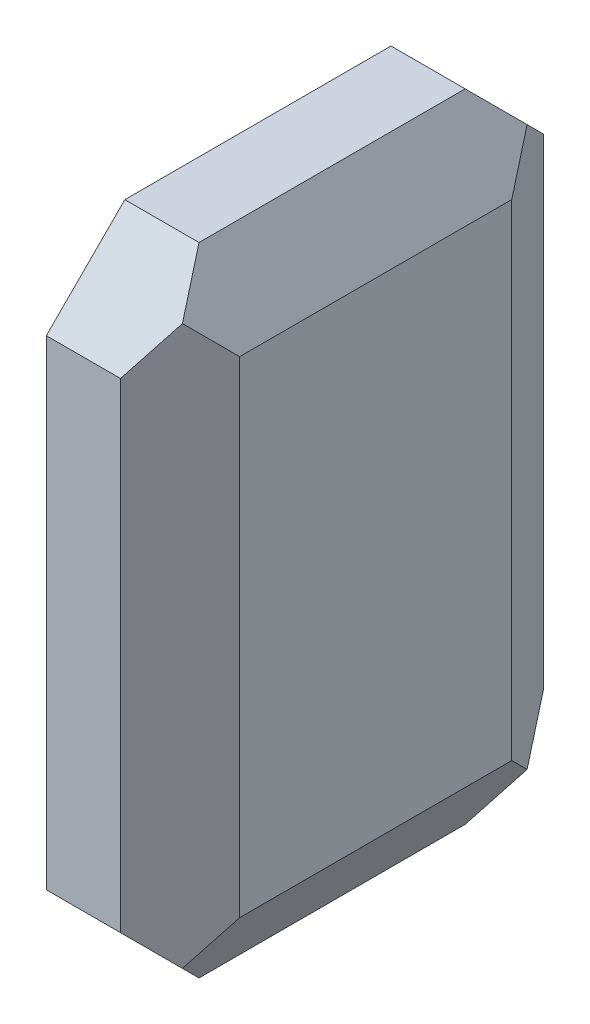
ISO-10303-21;
HEADER;
FILE_DESCRIPTION(('STEP AP214'),'2;1');
FILE_NAME('part.step','',(''),(''),'','','');
FILE_SCHEMA(('AUTOMOTIVE_DESIGN { 1 0 10303 214 1 1 1 1 }'));
ENDSEC;
DATA;
#1=APPLICATION_CONTEXT('core data for automotive mechanical design processes');
#2=APPLICATION_PROTOCOL_DEFINITION('international standard','automotive_design',2000,#1);
#3=PRODUCT_CONTEXT('',#1,'mechanical');
#4=PRODUCT('Part','Part','',(#3));
#5=PRODUCT_RELATED_PRODUCT_CATEGORY('part','',(#4));
#6=PRODUCT_DEFINITION_FORMATION('','',#4);
#7=PRODUCT_DEFINITION_CONTEXT('part definition',#1,'design');
#8=PRODUCT_DEFINITION('design','',#6,#7);
#9=PRODUCT_DEFINITION_SHAPE('','',#8);
#10=(LENGTH_UNIT() NAMED_UNIT(*) SI_UNIT(.MILLI.,.METRE.));
#11=(NAMED_UNIT(*) PLANE_ANGLE_UNIT() SI_UNIT($,.RADIAN.));
#12=(NAMED_UNIT(*) SI_UNIT($,.STERADIAN.) SOLID_ANGLE_UNIT());
#13=UNCERTAINTY_MEASURE_WITH_UNIT(LENGTH_MEASURE(1.E-05),#10,'distance_accuracy_value','');
#14=(GEOMETRIC_REPRESENTATION_CONTEXT(3) GLOBAL_UNCERTAINTY_ASSIGNED_CONTEXT((#13)) GLOBAL_UNIT_ASSIGNED_CONTEXT((#10,
#11,#12)) REPRESENTATION_CONTEXT('',''));
#15=CARTESIAN_POINT('',(0.,0.,0.));
#16=DIRECTION('',(0.,0.,1.));
#17=DIRECTION('',(1.,0.,0.));
#18=AXIS2_PLACEMENT_3D('',#15,#16,#17);
#19=CARTESIAN_POINT('',(6.858,0.,-24.638));
#20=DIRECTION('',(0.,1.,0.));
#21=DIRECTION('',(0.,0.,1.));
#22=AXIS2_PLACEMENT_3D('',#19,#20,#21);
#23=PLANE('',#22);
#24=DIRECTION('',(1.,0.,0.));
#25=VECTOR('',#24,1.);
#26=CARTESIAN_POINT('',(6.858,0.,-20.066));
#27=LINE('',#26,#25);
#28=CARTESIAN_POINT('',(0.,0.,-20.066));
#29=VERTEX_POINT('',#28);
#30=CARTESIAN_POINT('',(4.318,0.,-20.066));
#31=VERTEX_POINT('',#30);
#32=EDGE_CURVE('E157',#29,#31,#27,.T.);
#33=ORIENTED_EDGE('',*,*,#32,.T.);
#34=DIRECTION('',(0.,0.,1.));
#35=VECTOR('',#34,1.);
#36=CARTESIAN_POINT('',(4.318,0.,-24.638));
#37=LINE('',#36,#35);
#38=CARTESIAN_POINT('',(4.318,0.,-4.572));
#39=VERTEX_POINT('',#38);
#40=EDGE_CURVE('E152',#31,#39,#37,.T.);
#41=ORIENTED_EDGE('',*,*,#40,.T.);
#42=DIRECTION('',(-1.,0.,0.));
#43=VECTOR('',#42,1.);
#44=CARTESIAN_POINT('',(6.858,0.,-4.572));
#45=LINE('',#44,#43);
#46=CARTESIAN_POINT('',(0.,0.,-4.57200000000001));
#47=VERTEX_POINT('',#46);
#48=EDGE_CURVE('E145',#39,#47,#45,.T.);
#49=ORIENTED_EDGE('',*,*,#48,.T.);
#50=DIRECTION('',(0.,0.,-1.));
#51=VECTOR('',#50,1.);
#52=CARTESIAN_POINT('',(0.,0.,-24.638));
#53=LINE('',#52,#51);
#54=EDGE_CURVE('E149',#47,#29,#53,.T.);
#55=ORIENTED_EDGE('',*,*,#54,.T.);
#56=EDGE_LOOP('',(#33,#41,#49,#55));
#57=FACE_BOUND('',#56,.T.);
#58=ADVANCED_FACE('F52',(#57),#23,.F.);
#59=CARTESIAN_POINT('',(6.858,37.084,-24.638));
#60=DIRECTION('',(0.,0.,1.));
#61=DIRECTION('',(0.,-1.,0.));
#62=AXIS2_PLACEMENT_3D('',#59,#60,#61);
#63=PLANE('',#62);
#64=DIRECTION('',(1.,0.,0.));
#65=VECTOR('',#64,1.);
#66=CARTESIAN_POINT('',(6.858,32.512,-24.638));
#67=LINE('',#66,#65);
#68=CARTESIAN_POINT('',(0.,32.512,-24.638));
#69=VERTEX_POINT('',#68);
#70=CARTESIAN_POINT('',(4.31799999999999,32.512,-24.638));
#71=VERTEX_POINT('',#70);
#72=EDGE_CURVE('E207',#69,#71,#67,.T.);
#73=ORIENTED_EDGE('',*,*,#72,.T.);
#74=DIRECTION('',(0.,-1.,0.));
#75=VECTOR('',#74,1.);
#76=CARTESIAN_POINT('',(4.31799999999999,37.084,-24.638));
#77=LINE('',#76,#75);
#78=CARTESIAN_POINT('',(4.31799999999999,4.572,-24.638));
#79=VERTEX_POINT('',#78);
#80=EDGE_CURVE('E240',#71,#79,#77,.T.);
#81=ORIENTED_EDGE('',*,*,#80,.T.);
#82=DIRECTION('',(-1.,0.,0.));
#83=VECTOR('',#82,1.);
#84=CARTESIAN_POINT('',(6.858,4.572,-24.638));
#85=LINE('',#84,#83);
#86=CARTESIAN_POINT('',(0.,4.572,-24.638));
#87=VERTEX_POINT('',#86);
#88=EDGE_CURVE('E211',#79,#87,#85,.T.);
#89=ORIENTED_EDGE('',*,*,#88,.T.);
#90=DIRECTION('',(0.,1.,0.));
#91=VECTOR('',#90,1.);
#92=CARTESIAN_POINT('',(0.,37.084,-24.638));
#93=LINE('',#92,#91);
#94=EDGE_CURVE('E175',#87,#69,#93,.T.);
#95=ORIENTED_EDGE('',*,*,#94,.T.);
#96=EDGE_LOOP('',(#73,#81,#89,#95));
#97=FACE_BOUND('',#96,.T.);
#98=ADVANCED_FACE('F327',(#97),#63,.F.);
#99=CARTESIAN_POINT('',(6.858,37.084,0.));
#100=DIRECTION('',(0.,-1.,0.));
#101=DIRECTION('',(0.,0.,-1.));
#102=AXIS2_PLACEMENT_3D('',#99,#100,#101);
#103=PLANE('',#102);
#104=DIRECTION('',(1.,0.,0.));
#105=VECTOR('',#104,1.);
#106=CARTESIAN_POINT('',(6.858,37.084,-4.57200000000002));
#107=LINE('',#106,#105);
#108=CARTESIAN_POINT('',(0.,37.084,-4.57200000000002));
#109=VERTEX_POINT('',#108);
#110=CARTESIAN_POINT('',(4.318,37.084,-4.57200000000002));
#111=VERTEX_POINT('',#110);
#112=EDGE_CURVE('E217',#109,#111,#107,.T.);
#113=ORIENTED_EDGE('',*,*,#112,.T.);
#114=DIRECTION('',(0.,0.,-1.));
#115=VECTOR('',#114,1.);
#116=CARTESIAN_POINT('',(4.318,37.084,0.));
#117=LINE('',#116,#115);
#118=CARTESIAN_POINT('',(4.318,37.084,-20.066));
#119=VERTEX_POINT('',#118);
#120=EDGE_CURVE('E63',#111,#119,#117,.T.);
#121=ORIENTED_EDGE('',*,*,#120,.T.);
#122=DIRECTION('',(-1.,0.,0.));
#123=VECTOR('',#122,1.);
#124=CARTESIAN_POINT('',(6.858,37.084,-20.066));
#125=LINE('',#124,#123);
#126=CARTESIAN_POINT('',(0.,37.084,-20.066));
#127=VERTEX_POINT('',#126);
#128=EDGE_CURVE('E214',#119,#127,#125,.T.);
#129=ORIENTED_EDGE('',*,*,#128,.T.);
#130=DIRECTION('',(0.,0.,1.));
#131=VECTOR('',#130,1.);
#132=CARTESIAN_POINT('',(0.,37.084,0.));
#133=LINE('',#132,#131);
#134=EDGE_CURVE('E180',#127,#109,#133,.T.);
#135=ORIENTED_EDGE('',*,*,#134,.T.);
#136=EDGE_LOOP('',(#113,#121,#129,#135));
#137=FACE_BOUND('',#136,.T.);
#138=ADVANCED_FACE('F334',(#137),#103,.F.);
#139=CARTESIAN_POINT('',(6.858,0.,0.));
#140=DIRECTION('',(0.,0.,-1.));
#141=DIRECTION('',(-1.,0.,0.));
#142=AXIS2_PLACEMENT_3D('',#139,#140,#141);
#143=PLANE('',#142);
#144=DIRECTION('',(1.,0.,0.));
#145=VECTOR('',#144,1.);
#146=CARTESIAN_POINT('',(6.858,4.57200000000001,0.));
#147=LINE('',#146,#145);
#148=CARTESIAN_POINT('',(0.,4.57200000000001,0.));
#149=VERTEX_POINT('',#148);
#150=CARTESIAN_POINT('',(4.318,4.57200000000001,0.));
#151=VERTEX_POINT('',#150);
#152=EDGE_CURVE('E163',#149,#151,#147,.T.);
#153=ORIENTED_EDGE('',*,*,#152,.T.);
#154=DIRECTION('',(0.,1.,0.));
#155=VECTOR('',#154,1.);
#156=CARTESIAN_POINT('',(4.318,0.,0.));
#157=LINE('',#156,#155);
#158=CARTESIAN_POINT('',(4.318,32.512,0.));
#159=VERTEX_POINT('',#158);
#160=EDGE_CURVE('E231',#151,#159,#157,.T.);
#161=ORIENTED_EDGE('',*,*,#160,.T.);
#162=DIRECTION('',(-1.,0.,0.));
#163=VECTOR('',#162,1.);
#164=CARTESIAN_POINT('',(6.858,32.512,0.));
#165=LINE('',#164,#163);
#166=CARTESIAN_POINT('',(0.,32.512,0.));
#167=VERTEX_POINT('',#166);
#168=EDGE_CURVE('E168',#159,#167,#165,.T.);
#169=ORIENTED_EDGE('',*,*,#168,.T.);
#170=DIRECTION('',(0.,-1.,0.));
#171=VECTOR('',#170,1.);
#172=CARTESIAN_POINT('',(0.,0.,0.));
#173=LINE('',#172,#171);
#174=EDGE_CURVE('E191',#167,#149,#173,.T.);
#175=ORIENTED_EDGE('',*,*,#174,.T.);
#176=EDGE_LOOP('',(#153,#161,#169,#175));
#177=FACE_BOUND('',#176,.T.);
#178=ADVANCED_FACE('F397',(#177),#143,.F.);
#179=CARTESIAN_POINT('',(6.858,0.,0.));
#180=DIRECTION('',(-1.,0.,0.));
#181=DIRECTION('',(0.,0.,1.));
#182=AXIS2_PLACEMENT_3D('',#179,#180,#181);
#183=PLANE('',#182);
#184=DIRECTION('',(0.,-1.,0.));
#185=VECTOR('',#184,1.);
#186=CARTESIAN_POINT('',(6.858,0.,-4.39940905122494));
#187=LINE('',#186,#185);
#188=CARTESIAN_POINT('',(6.858,32.6845909487751,-4.39940905122494));
#189=VERTEX_POINT('',#188);
#190=CARTESIAN_POINT('',(6.858,4.39940905122494,-4.39940905122494));
#191=VERTEX_POINT('',#190);
#192=EDGE_CURVE('E224',#189,#191,#187,.T.);
#193=ORIENTED_EDGE('',*,*,#192,.T.);
#194=DIRECTION('',(0.,0.,-1.));
#195=VECTOR('',#194,1.);
#196=CARTESIAN_POINT('',(6.858,4.39940905122494,0.));
#197=LINE('',#196,#195);
#198=CARTESIAN_POINT('',(6.858,4.39940905122494,-20.238590948775));
#199=VERTEX_POINT('',#198);
#200=EDGE_CURVE('E251',#191,#199,#197,.T.);
#201=ORIENTED_EDGE('',*,*,#200,.T.);
#202=DIRECTION('',(0.,1.,0.));
#203=VECTOR('',#202,1.);
#204=CARTESIAN_POINT('',(6.858,0.,-20.238590948775));
#205=LINE('',#204,#203);
#206=CARTESIAN_POINT('',(6.858,32.6845909487751,-20.2385909487751));
#207=VERTEX_POINT('',#206);
#208=EDGE_CURVE('E220',#199,#207,#205,.T.);
#209=ORIENTED_EDGE('',*,*,#208,.T.);
#210=DIRECTION('',(0.,0.,1.));
#211=VECTOR('',#210,1.);
#212=CARTESIAN_POINT('',(6.858,32.6845909487751,0.));
#213=LINE('',#212,#211);
#214=EDGE_CURVE('E247',#207,#189,#213,.T.);
#215=ORIENTED_EDGE('',*,*,#214,.T.);
#216=EDGE_LOOP('',(#193,#201,#209,#215));
#217=FACE_BOUND('',#216,.T.);
#218=ADVANCED_FACE('F408',(#217),#183,.F.);
#219=CARTESIAN_POINT('',(0.,0.,0.));
#220=DIRECTION('',(-1.,0.,0.));
#221=DIRECTION('',(0.,0.,1.));
#222=AXIS2_PLACEMENT_3D('',#219,#220,#221);
#223=PLANE('',#222);
#224=CARTESIAN_POINT('',(0.,28.5419999999999,-2.31900000000019));
#225=DIRECTION('',(-1.,0.,0.));
#226=DIRECTION('',(0.,0.,1.));
#227=AXIS2_PLACEMENT_3D('',#224,#225,#226);
#228=CIRCLE('',#227,1.);
#229=CARTESIAN_POINT('',(0.,28.5419999999999,-3.31900000000019));
#230=VERTEX_POINT('',#229);
#231=EDGE_CURVE('E57',#230,#230,#228,.F.);
#232=ORIENTED_EDGE('',*,*,#231,.T.);
#233=EDGE_LOOP('',(#232));
#234=FACE_BOUND('',#233,.T.);
#235=CARTESIAN_POINT('',(0.,28.5419999999998,-22.3190000000002));
#236=DIRECTION('',(-1.,0.,0.));
#237=DIRECTION('',(0.,0.,1.));
#238=AXIS2_PLACEMENT_3D('',#235,#236,#237);
#239=CIRCLE('',#238,1.);
#240=CARTESIAN_POINT('',(0.,28.5419999999998,-23.3190000000002));
#241=VERTEX_POINT('',#240);
#242=EDGE_CURVE('E183',#241,#241,#239,.F.);
#243=ORIENTED_EDGE('',*,*,#242,.T.);
#244=EDGE_LOOP('',(#243));
#245=FACE_BOUND('',#244,.T.);
#246=CARTESIAN_POINT('',(0.,8.54199999999976,-22.319));
#247=DIRECTION('',(-1.,0.,0.));
#248=DIRECTION('',(0.,0.,1.));
#249=AXIS2_PLACEMENT_3D('',#246,#247,#248);
#250=CIRCLE('',#249,0.999999999999997);
#251=CARTESIAN_POINT('',(0.,8.54199999999976,-23.319));
#252=VERTEX_POINT('',#251);
#253=EDGE_CURVE('E283',#252,#252,#250,.F.);
#254=ORIENTED_EDGE('',*,*,#253,.T.);
#255=EDGE_LOOP('',(#254));
#256=FACE_BOUND('',#255,.T.);
#257=CARTESIAN_POINT('',(0.,8.54200000000001,-2.31900000000001));
#258=DIRECTION('',(-1.,0.,0.));
#259=DIRECTION('',(0.,0.,1.));
#260=AXIS2_PLACEMENT_3D('',#257,#258,#259);
#261=CIRCLE('',#260,1.);
#262=CARTESIAN_POINT('',(0.,8.54200000000001,-3.31900000000001));
#263=VERTEX_POINT('',#262);
#264=EDGE_CURVE('E279',#263,#263,#261,.F.);
#265=ORIENTED_EDGE('',*,*,#264,.T.);
#266=EDGE_LOOP('',(#265));
#267=FACE_BOUND('',#266,.T.);
#268=ORIENTED_EDGE('',*,*,#54,.F.);
#269=DIRECTION('',(0.,-0.707106781186549,-0.707106781186546));
#270=VECTOR('',#269,1.);
#271=CARTESIAN_POINT('',(0.,2.286,-2.28600000000001));
#272=LINE('',#271,#270);
#273=EDGE_CURVE('E160',#47,#149,#272,.F.);
#274=ORIENTED_EDGE('',*,*,#273,.T.);
#275=ORIENTED_EDGE('',*,*,#174,.F.);
#276=DIRECTION('',(0.,-0.707106781186546,0.707106781186549));
#277=VECTOR('',#276,1.);
#278=CARTESIAN_POINT('',(0.,16.256,16.256));
#279=LINE('',#278,#277);
#280=EDGE_CURVE('E198',#167,#109,#279,.F.);
#281=ORIENTED_EDGE('',*,*,#280,.T.);
#282=ORIENTED_EDGE('',*,*,#134,.F.);
#283=DIRECTION('',(0.,0.707106781186549,0.707106781186546));
#284=VECTOR('',#283,1.);
#285=CARTESIAN_POINT('',(0.,28.5749999999999,-28.575));
#286=LINE('',#285,#284);
#287=EDGE_CURVE('E156',#127,#69,#286,.F.);
#288=ORIENTED_EDGE('',*,*,#287,.T.);
#289=ORIENTED_EDGE('',*,*,#94,.F.);
#290=DIRECTION('',(0.,0.707106781186546,-0.707106781186549));
#291=VECTOR('',#290,1.);
#292=CARTESIAN_POINT('',(0.,-10.033,-10.033));
#293=LINE('',#292,#291);
#294=EDGE_CURVE('E169',#87,#29,#293,.F.);
#295=ORIENTED_EDGE('',*,*,#294,.T.);
#296=EDGE_LOOP('',(#268,#274,#275,#281,#282,#288,#289,#295));
#297=FACE_BOUND('',#296,.T.);
#298=ADVANCED_FACE('F171',(#234,#245,#256,#267,#297),#223,.T.);
#299=CARTESIAN_POINT('',(6.858,0.,-4.572));
#300=DIRECTION('',(0.,0.707106781186546,-0.707106781186549));
#301=DIRECTION('',(-1.,0.,0.));
#302=AXIS2_PLACEMENT_3D('',#299,#300,#301);
#303=PLANE('',#302);
#304=ORIENTED_EDGE('',*,*,#48,.F.);
#305=DIRECTION('',(0.377964473009228,0.654653670707978,0.654653670707976));
#306=VECTOR('',#305,1.);
#307=CARTESIAN_POINT('',(4.68085714285714,0.628487007317852,-3.94351299268215));
#308=LINE('',#307,#306);
#309=CARTESIAN_POINT('',(5.63782271536749,2.286,-2.286));
#310=VERTEX_POINT('',#309);
#311=EDGE_CURVE('E266',#39,#310,#308,.T.);
#312=ORIENTED_EDGE('',*,*,#311,.T.);
#313=DIRECTION('',(-0.377964473009227,0.654653670707978,0.654653670707976));
#314=VECTOR('',#313,1.);
#315=CARTESIAN_POINT('',(6.94341036920141,0.0246558498250085,-4.54734415017499));
#316=LINE('',#315,#314);
#317=EDGE_CURVE('E228',#310,#151,#316,.T.);
#318=ORIENTED_EDGE('',*,*,#317,.T.);
#319=ORIENTED_EDGE('',*,*,#152,.F.);
#320=ORIENTED_EDGE('',*,*,#273,.F.);
#321=EDGE_LOOP('',(#304,#312,#318,#319,#320));
#322=FACE_BOUND('',#321,.T.);
#323=ADVANCED_FACE('F161',(#322),#303,.F.);
#324=CARTESIAN_POINT('',(6.858,4.572,-24.638));
#325=DIRECTION('',(0.,0.707106781186549,0.707106781186546));
#326=DIRECTION('',(-1.,0.,0.));
#327=AXIS2_PLACEMENT_3D('',#324,#325,#326);
#328=PLANE('',#327);
#329=DIRECTION('',(0.377964473009229,-0.654653670707976,0.654653670707978));
#330=VECTOR('',#329,1.);
#331=CARTESIAN_POINT('',(4.68085714285714,3.94351299268215,-24.0095129926821));
#332=LINE('',#331,#330);
#333=CARTESIAN_POINT('',(5.63782271536748,2.286,-22.352));
#334=VERTEX_POINT('',#333);
#335=EDGE_CURVE('E243',#79,#334,#332,.T.);
#336=ORIENTED_EDGE('',*,*,#335,.T.);
#337=DIRECTION('',(-0.377964473009227,-0.654653670707976,0.654653670707978));
#338=VECTOR('',#337,1.);
#339=CARTESIAN_POINT('',(6.94341036920141,4.54734415017499,-24.613344150175));
#340=LINE('',#339,#338);
#341=EDGE_CURVE('E261',#334,#31,#340,.T.);
#342=ORIENTED_EDGE('',*,*,#341,.T.);
#343=ORIENTED_EDGE('',*,*,#32,.F.);
#344=ORIENTED_EDGE('',*,*,#294,.F.);
#345=ORIENTED_EDGE('',*,*,#88,.F.);
#346=EDGE_LOOP('',(#336,#342,#343,#344,#345));
#347=FACE_BOUND('',#346,.T.);
#348=ADVANCED_FACE('F345',(#347),#328,.F.);
#349=CARTESIAN_POINT('',(6.858,32.512,0.));
#350=DIRECTION('',(0.,-0.707106781186549,-0.707106781186546));
#351=DIRECTION('',(-1.,0.,0.));
#352=AXIS2_PLACEMENT_3D('',#349,#350,#351);
#353=PLANE('',#352);
#354=DIRECTION('',(0.377964473009228,0.654653670707976,-0.654653670707978));
#355=VECTOR('',#354,1.);
#356=CARTESIAN_POINT('',(4.68085714285714,33.1404870073179,-0.628487007317852));
#357=LINE('',#356,#355);
#358=CARTESIAN_POINT('',(5.63782271536749,34.798,-2.286));
#359=VERTEX_POINT('',#358);
#360=EDGE_CURVE('E234',#159,#359,#357,.T.);
#361=ORIENTED_EDGE('',*,*,#360,.T.);
#362=DIRECTION('',(-0.377964473009227,0.654653670707976,-0.654653670707978));
#363=VECTOR('',#362,1.);
#364=CARTESIAN_POINT('',(6.94341036920141,32.536655849825,-0.0246558498250085));
#365=LINE('',#364,#363);
#366=EDGE_CURVE('E78',#359,#111,#365,.T.);
#367=ORIENTED_EDGE('',*,*,#366,.T.);
#368=ORIENTED_EDGE('',*,*,#112,.F.);
#369=ORIENTED_EDGE('',*,*,#280,.F.);
#370=ORIENTED_EDGE('',*,*,#168,.F.);
#371=EDGE_LOOP('',(#361,#367,#368,#369,#370));
#372=FACE_BOUND('',#371,.T.);
#373=ADVANCED_FACE('F351',(#372),#353,.F.);
#374=CARTESIAN_POINT('',(6.858,37.084,-20.066));
#375=DIRECTION('',(0.,-0.707106781186546,0.707106781186549));
#376=DIRECTION('',(-1.,0.,0.));
#377=AXIS2_PLACEMENT_3D('',#374,#375,#376);
#378=PLANE('',#377);
#379=ORIENTED_EDGE('',*,*,#128,.F.);
#380=DIRECTION('',(0.377964473009228,-0.654653670707978,-0.654653670707976));
#381=VECTOR('',#380,1.);
#382=CARTESIAN_POINT('',(4.68085714285714,36.4555129926822,-20.6944870073178));
#383=LINE('',#382,#381);
#384=CARTESIAN_POINT('',(5.63782271536749,34.798,-22.352));
#385=VERTEX_POINT('',#384);
#386=EDGE_CURVE('E11',#119,#385,#383,.T.);
#387=ORIENTED_EDGE('',*,*,#386,.T.);
#388=DIRECTION('',(-0.377964473009228,-0.654653670707978,-0.654653670707976));
#389=VECTOR('',#388,1.);
#390=CARTESIAN_POINT('',(6.9434103692014,37.059344150175,-20.090655849825));
#391=LINE('',#390,#389);
#392=EDGE_CURVE('E237',#385,#71,#391,.T.);
#393=ORIENTED_EDGE('',*,*,#392,.T.);
#394=ORIENTED_EDGE('',*,*,#72,.F.);
#395=ORIENTED_EDGE('',*,*,#287,.F.);
#396=EDGE_LOOP('',(#379,#387,#393,#394,#395));
#397=FACE_BOUND('',#396,.T.);
#398=ADVANCED_FACE('F358',(#397),#378,.F.);
#399=CARTESIAN_POINT('',(6.858,0.,-4.39940905122494));
#400=DIRECTION('',(-0.866025403784438,0.,-0.500000000000001));
#401=DIRECTION('',(0.,-1.,0.));
#402=AXIS2_PLACEMENT_3D('',#399,#400,#401);
#403=PLANE('',#402);
#404=ORIENTED_EDGE('',*,*,#317,.F.);
#405=DIRECTION('',(0.377964473009228,0.654653670707977,-0.654653670707977));
#406=VECTOR('',#405,1.);
#407=CARTESIAN_POINT('',(5.76942857142857,2.5139480292714,-2.5139480292714));
#408=LINE('',#407,#406);
#409=EDGE_CURVE('E272',#310,#191,#408,.T.);
#410=ORIENTED_EDGE('',*,*,#409,.T.);
#411=ORIENTED_EDGE('',*,*,#192,.F.);
#412=DIRECTION('',(-0.377964473009228,0.654653670707977,0.654653670707977));
#413=VECTOR('',#412,1.);
#414=CARTESIAN_POINT('',(14.9453388782692,18.6769091135858,-18.4070908864142));
#415=LINE('',#414,#413);
#416=EDGE_CURVE('E269',#189,#359,#415,.T.);
#417=ORIENTED_EDGE('',*,*,#416,.T.);
#418=ORIENTED_EDGE('',*,*,#360,.F.);
#419=ORIENTED_EDGE('',*,*,#160,.F.);
#420=EDGE_LOOP('',(#404,#410,#411,#417,#418,#419));
#421=FACE_BOUND('',#420,.T.);
#422=ADVANCED_FACE('F364',(#421),#403,.F.);
#423=CARTESIAN_POINT('',(6.858,0.,-20.238590948775));
#424=DIRECTION('',(-0.866025403784438,0.,0.500000000000001));
#425=DIRECTION('',(0.,1.,0.));
#426=AXIS2_PLACEMENT_3D('',#423,#424,#425);
#427=PLANE('',#426);
#428=ORIENTED_EDGE('',*,*,#208,.F.);
#429=DIRECTION('',(-0.377964473009228,-0.654653670707978,-0.654653670707976));
#430=VECTOR('',#429,1.);
#431=CARTESIAN_POINT('',(5.76942857142857,2.51394802927139,-22.1240519707286));
#432=LINE('',#431,#430);
#433=EDGE_CURVE('E258',#199,#334,#432,.T.);
#434=ORIENTED_EDGE('',*,*,#433,.T.);
#435=ORIENTED_EDGE('',*,*,#335,.F.);
#436=ORIENTED_EDGE('',*,*,#80,.F.);
#437=ORIENTED_EDGE('',*,*,#392,.F.);
#438=DIRECTION('',(0.377964473009228,-0.654653670707977,0.654653670707976));
#439=VECTOR('',#438,1.);
#440=CARTESIAN_POINT('',(14.9453388782692,18.6769091135857,-6.23090911358575));
#441=LINE('',#440,#439);
#442=EDGE_CURVE('E255',#385,#207,#441,.T.);
#443=ORIENTED_EDGE('',*,*,#442,.T.);
#444=EDGE_LOOP('',(#428,#434,#435,#436,#437,#443));
#445=FACE_BOUND('',#444,.T.);
#446=ADVANCED_FACE('F371',(#445),#427,.F.);
#447=CARTESIAN_POINT('',(6.858,4.39940905122494,0.));
#448=DIRECTION('',(-0.866025403784438,0.500000000000001,0.));
#449=DIRECTION('',(0.,0.,-1.));
#450=AXIS2_PLACEMENT_3D('',#447,#448,#449);
#451=PLANE('',#450);
#452=ORIENTED_EDGE('',*,*,#311,.F.);
#453=ORIENTED_EDGE('',*,*,#40,.F.);
#454=ORIENTED_EDGE('',*,*,#341,.F.);
#455=ORIENTED_EDGE('',*,*,#433,.F.);
#456=ORIENTED_EDGE('',*,*,#200,.F.);
#457=ORIENTED_EDGE('',*,*,#409,.F.);
#458=EDGE_LOOP('',(#452,#453,#454,#455,#456,#457));
#459=FACE_BOUND('',#458,.T.);
#460=ADVANCED_FACE('F377',(#459),#451,.F.);
#461=CARTESIAN_POINT('',(6.858,32.6845909487751,0.));
#462=DIRECTION('',(-0.866025403784438,-0.500000000000001,0.));
#463=DIRECTION('',(0.,0.,1.));
#464=AXIS2_PLACEMENT_3D('',#461,#462,#463);
#465=PLANE('',#464);
#466=ORIENTED_EDGE('',*,*,#386,.F.);
#467=ORIENTED_EDGE('',*,*,#120,.F.);
#468=ORIENTED_EDGE('',*,*,#366,.F.);
#469=ORIENTED_EDGE('',*,*,#416,.F.);
#470=ORIENTED_EDGE('',*,*,#214,.F.);
#471=ORIENTED_EDGE('',*,*,#442,.F.);
#472=EDGE_LOOP('',(#466,#467,#468,#469,#470,#471));
#473=FACE_BOUND('',#472,.T.);
#474=ADVANCED_FACE('F55',(#473),#465,.F.);
#475=CARTESIAN_POINT('',(-1.2E-05,8.54200000000001,-2.31900000000001));
#476=DIRECTION('',(1.,0.,0.));
#477=DIRECTION('',(0.,0.,-1.));
#478=AXIS2_PLACEMENT_3D('',#475,#476,#477);
#479=CYLINDRICAL_SURFACE('',#478,1.);
#480=CARTESIAN_POINT('',(2.54,8.54200000000001,-2.31900000000001));
#481=DIRECTION('',(-1.,0.,0.));
#482=DIRECTION('',(0.,0.,1.));
#483=AXIS2_PLACEMENT_3D('',#480,#481,#482);
#484=CIRCLE('',#483,1.);
#485=CARTESIAN_POINT('',(2.54,8.54200000000001,-3.31900000000001));
#486=VERTEX_POINT('',#485);
#487=EDGE_CURVE('E185',#486,#486,#484,.T.);
#488=CARTESIAN_POINT('',(0.,8.54200000000001,-3.31900000000001));
#489=CARTESIAN_POINT('',(0.0264583333333333,8.54200000000001,-3.31900000000001));
#490=CARTESIAN_POINT('',(0.0529166666666667,8.54200000000001,-3.31900000000001));
#491=CARTESIAN_POINT('',(0.105833333333333,8.54200000000001,-3.31900000000001));
#492=CARTESIAN_POINT('',(0.132291666666667,8.54200000000001,-3.31900000000001));
#493=CARTESIAN_POINT('',(0.185208333333333,8.54200000000001,-3.31900000000001));
#494=CARTESIAN_POINT('',(0.211666666666667,8.54200000000001,-3.31900000000001));
#495=CARTESIAN_POINT('',(0.264583333333333,8.54200000000001,-3.31900000000001));
#496=CARTESIAN_POINT('',(0.291041666666667,8.54200000000001,-3.31900000000001));
#497=CARTESIAN_POINT('',(0.343958333333333,8.54200000000001,-3.31900000000001));
#498=CARTESIAN_POINT('',(0.370416666666667,8.54200000000001,-3.31900000000001));
#499=CARTESIAN_POINT('',(0.423333333333333,8.54200000000001,-3.31900000000001));
#500=CARTESIAN_POINT('',(0.449791666666667,8.54200000000001,-3.31900000000001));
#501=CARTESIAN_POINT('',(0.502708333333334,8.54200000000001,-3.31900000000001));
#502=CARTESIAN_POINT('',(0.529166666666667,8.54200000000001,-3.31900000000001));
#503=CARTESIAN_POINT('',(0.582083333333333,8.54200000000001,-3.31900000000001));
#504=CARTESIAN_POINT('',(0.608541666666667,8.54200000000001,-3.31900000000001));
#505=CARTESIAN_POINT('',(0.661458333333333,8.54200000000001,-3.31900000000001));
#506=CARTESIAN_POINT('',(0.687916666666667,8.54200000000001,-3.31900000000001));
#507=CARTESIAN_POINT('',(0.740833333333333,8.54200000000001,-3.31900000000001));
#508=CARTESIAN_POINT('',(0.767291666666667,8.54200000000001,-3.31900000000001));
#509=CARTESIAN_POINT('',(0.820208333333334,8.54200000000001,-3.31900000000001));
#510=CARTESIAN_POINT('',(0.846666666666667,8.54200000000001,-3.31900000000001));
#511=CARTESIAN_POINT('',(0.899583333333334,8.54200000000001,-3.31900000000001));
#512=CARTESIAN_POINT('',(0.926041666666667,8.54200000000001,-3.31900000000001));
#513=CARTESIAN_POINT('',(0.978958333333334,8.54200000000001,-3.31900000000001));
#514=CARTESIAN_POINT('',(1.00541666666667,8.54200000000001,-3.31900000000001));
#515=CARTESIAN_POINT('',(1.05833333333333,8.54200000000001,-3.31900000000001));
#516=CARTESIAN_POINT('',(1.08479166666667,8.54200000000001,-3.31900000000001));
#517=CARTESIAN_POINT('',(1.13770833333333,8.54200000000001,-3.31900000000001));
#518=CARTESIAN_POINT('',(1.16416666666667,8.54200000000001,-3.31900000000001));
#519=CARTESIAN_POINT('',(1.21708333333333,8.54200000000001,-3.31900000000001));
#520=CARTESIAN_POINT('',(1.24354166666667,8.54200000000001,-3.31900000000001));
#521=CARTESIAN_POINT('',(1.29645833333333,8.54200000000001,-3.31900000000001));
#522=CARTESIAN_POINT('',(1.32291666666667,8.54200000000001,-3.31900000000001));
#523=CARTESIAN_POINT('',(1.37583333333333,8.54200000000001,-3.31900000000001));
#524=CARTESIAN_POINT('',(1.40229166666667,8.54200000000001,-3.31900000000001));
#525=CARTESIAN_POINT('',(1.45520833333333,8.54200000000001,-3.31900000000001));
#526=CARTESIAN_POINT('',(1.48166666666667,8.54200000000001,-3.31900000000001));
#527=CARTESIAN_POINT('',(1.53458333333333,8.54200000000001,-3.31900000000001));
#528=CARTESIAN_POINT('',(1.56104166666667,8.54200000000001,-3.31900000000001));
#529=CARTESIAN_POINT('',(1.61395833333333,8.54200000000001,-3.31900000000001));
#530=CARTESIAN_POINT('',(1.64041666666667,8.54200000000001,-3.31900000000001));
#531=CARTESIAN_POINT('',(1.69333333333333,8.54200000000001,-3.31900000000001));
#532=CARTESIAN_POINT('',(1.71979166666667,8.54200000000001,-3.31900000000001));
#533=CARTESIAN_POINT('',(1.77270833333333,8.54200000000001,-3.31900000000001));
#534=CARTESIAN_POINT('',(1.79916666666667,8.54200000000001,-3.31900000000001));
#535=CARTESIAN_POINT('',(1.85208333333333,8.54200000000001,-3.31900000000001));
#536=CARTESIAN_POINT('',(1.87854166666667,8.54200000000001,-3.31900000000001));
#537=CARTESIAN_POINT('',(1.93145833333333,8.54200000000001,-3.31900000000001));
#538=CARTESIAN_POINT('',(1.95791666666667,8.54200000000001,-3.31900000000001));
#539=CARTESIAN_POINT('',(2.01083333333333,8.54200000000001,-3.31900000000001));
#540=CARTESIAN_POINT('',(2.03729166666667,8.54200000000001,-3.31900000000001));
#541=CARTESIAN_POINT('',(2.09020833333333,8.54200000000001,-3.31900000000001));
#542=CARTESIAN_POINT('',(2.11666666666667,8.54200000000001,-3.31900000000001));
#543=CARTESIAN_POINT('',(2.16958333333333,8.54200000000001,-3.31900000000001));
#544=CARTESIAN_POINT('',(2.19604166666667,8.54200000000001,-3.31900000000001));
#545=CARTESIAN_POINT('',(2.24895833333333,8.54200000000001,-3.31900000000001));
#546=CARTESIAN_POINT('',(2.27541666666667,8.54200000000001,-3.31900000000001));
#547=CARTESIAN_POINT('',(2.32833333333333,8.54200000000001,-3.31900000000001));
#548=CARTESIAN_POINT('',(2.35479166666667,8.54200000000001,-3.31900000000001));
#549=CARTESIAN_POINT('',(2.40770833333333,8.54200000000001,-3.31900000000001));
#550=CARTESIAN_POINT('',(2.43416666666667,8.54200000000001,-3.31900000000001));
#551=CARTESIAN_POINT('',(2.48708333333333,8.54200000000001,-3.31900000000001));
#552=CARTESIAN_POINT('',(2.51354166666667,8.54200000000001,-3.31900000000001));
#553=CARTESIAN_POINT('',(2.54,8.54200000000001,-3.31900000000001));
#554=B_SPLINE_CURVE_WITH_KNOTS('',3,(#488,#489,#490,#491,#492,#493,#494,#495,#496,#497,#498,
#499,#500,#501,#502,#503,#504,#505,#506,#507,#508,#509,#510,#511,#512,#513,#514,#515,#516,#517,
#518,#519,#520,#521,#522,#523,#524,#525,#526,#527,#528,#529,#530,#531,#532,#533,#534,#535,#536,
#537,#538,#539,#540,#541,#542,#543,#544,#545,#546,#547,#548,#549,#550,#551,#552,#553),
.UNSPECIFIED.,.F.,.F.,(4,2,2,2,2,2,2,2,2,2,2,2,2,2,2,2,2,2,2,2,2,2,2,2,2,2,2,2,2,2,2,2,4),(0.,
0.079375,0.15875,0.238125,0.3175,0.396875,0.47625,0.555625,0.635,0.714375,0.79375,0.873125,
0.9525,1.031875,1.11125,1.190625,1.27,1.349375,1.42875,1.508125,1.5875,1.666875,1.74625,
1.825625,1.905,1.984375,2.06375,2.143125,2.2225,2.301875,2.38125,2.460625,2.54),.UNSPECIFIED.);
#555=EDGE_CURVE('BSEAM386',#263,#486,#554,.T.);
#556=ORIENTED_EDGE('',*,*,#264,.F.);
#557=ORIENTED_EDGE('',*,*,#487,.F.);
#558=ORIENTED_EDGE('',*,*,#555,.T.);
#559=ORIENTED_EDGE('',*,*,#555,.F.);
#560=EDGE_LOOP('',(#556,#558,#557,#559));
#561=FACE_BOUND('',#560,.T.);
#562=ADVANCED_FACE('F386',(#561),#479,.F.);
#563=CARTESIAN_POINT('',(2.54,8.54200000000001,-2.31900000000001));
#564=DIRECTION('',(-1.,0.,0.));
#565=DIRECTION('',(0.,0.,1.));
#566=AXIS2_PLACEMENT_3D('',#563,#564,#565);
#567=PLANE('',#566);
#568=ORIENTED_EDGE('',*,*,#487,.T.);
#569=EDGE_LOOP('',(#568));
#570=FACE_BOUND('',#569,.T.);
#571=ADVANCED_FACE('F502',(#570),#567,.T.);
#572=CARTESIAN_POINT('',(-1.2E-05,8.54199999999976,-22.319));
#573=DIRECTION('',(1.,0.,0.));
#574=DIRECTION('',(0.,0.,-1.));
#575=AXIS2_PLACEMENT_3D('',#572,#573,#574);
#576=CYLINDRICAL_SURFACE('',#575,0.999999999999997);
#577=CARTESIAN_POINT('',(2.54,8.54199999999976,-22.319));
#578=DIRECTION('',(-1.,0.,0.));
#579=DIRECTION('',(0.,0.,1.));
#580=AXIS2_PLACEMENT_3D('',#577,#578,#579);
#581=CIRCLE('',#580,0.999999999999997);
#582=CARTESIAN_POINT('',(2.54,8.54199999999976,-23.319));
#583=VERTEX_POINT('',#582);
#584=EDGE_CURVE('E303',#583,#583,#581,.T.);
#585=CARTESIAN_POINT('',(0.,8.54199999999976,-23.319));
#586=CARTESIAN_POINT('',(0.0264583333333333,8.54199999999976,-23.319));
#587=CARTESIAN_POINT('',(0.0529166666666667,8.54199999999976,-23.319));
#588=CARTESIAN_POINT('',(0.105833333333333,8.54199999999976,-23.319));
#589=CARTESIAN_POINT('',(0.132291666666667,8.54199999999976,-23.319));
#590=CARTESIAN_POINT('',(0.185208333333333,8.54199999999976,-23.319));
#591=CARTESIAN_POINT('',(0.211666666666667,8.54199999999976,-23.319));
#592=CARTESIAN_POINT('',(0.264583333333333,8.54199999999976,-23.319));
#593=CARTESIAN_POINT('',(0.291041666666667,8.54199999999976,-23.319));
#594=CARTESIAN_POINT('',(0.343958333333333,8.54199999999976,-23.319));
#595=CARTESIAN_POINT('',(0.370416666666667,8.54199999999976,-23.319));
#596=CARTESIAN_POINT('',(0.423333333333333,8.54199999999976,-23.319));
#597=CARTESIAN_POINT('',(0.449791666666667,8.54199999999976,-23.319));
#598=CARTESIAN_POINT('',(0.502708333333334,8.54199999999976,-23.319));
#599=CARTESIAN_POINT('',(0.529166666666667,8.54199999999976,-23.319));
#600=CARTESIAN_POINT('',(0.582083333333333,8.54199999999976,-23.319));
#601=CARTESIAN_POINT('',(0.608541666666667,8.54199999999976,-23.319));
#602=CARTESIAN_POINT('',(0.661458333333333,8.54199999999976,-23.319));
#603=CARTESIAN_POINT('',(0.687916666666667,8.54199999999976,-23.319));
#604=CARTESIAN_POINT('',(0.740833333333333,8.54199999999976,-23.319));
#605=CARTESIAN_POINT('',(0.767291666666667,8.54199999999976,-23.319));
#606=CARTESIAN_POINT('',(0.820208333333334,8.54199999999976,-23.319));
#607=CARTESIAN_POINT('',(0.846666666666667,8.54199999999976,-23.319));
#608=CARTESIAN_POINT('',(0.899583333333334,8.54199999999976,-23.319));
#609=CARTESIAN_POINT('',(0.926041666666667,8.54199999999976,-23.319));
#610=CARTESIAN_POINT('',(0.978958333333334,8.54199999999976,-23.319));
#611=CARTESIAN_POINT('',(1.00541666666667,8.54199999999976,-23.319));
#612=CARTESIAN_POINT('',(1.05833333333333,8.54199999999976,-23.319));
#613=CARTESIAN_POINT('',(1.08479166666667,8.54199999999976,-23.319));
#614=CARTESIAN_POINT('',(1.13770833333333,8.54199999999976,-23.319));
#615=CARTESIAN_POINT('',(1.16416666666667,8.54199999999976,-23.319));
#616=CARTESIAN_POINT('',(1.21708333333333,8.54199999999976,-23.319));
#617=CARTESIAN_POINT('',(1.24354166666667,8.54199999999976,-23.319));
#618=CARTESIAN_POINT('',(1.29645833333333,8.54199999999976,-23.319));
#619=CARTESIAN_POINT('',(1.32291666666667,8.54199999999976,-23.319));
#620=CARTESIAN_POINT('',(1.37583333333333,8.54199999999976,-23.319));
#621=CARTESIAN_POINT('',(1.40229166666667,8.54199999999976,-23.319));
#622=CARTESIAN_POINT('',(1.45520833333333,8.54199999999976,-23.319));
#623=CARTESIAN_POINT('',(1.48166666666667,8.54199999999976,-23.319));
#624=CARTESIAN_POINT('',(1.53458333333333,8.54199999999976,-23.319));
#625=CARTESIAN_POINT('',(1.56104166666667,8.54199999999976,-23.319));
#626=CARTESIAN_POINT('',(1.61395833333333,8.54199999999976,-23.319));
#627=CARTESIAN_POINT('',(1.64041666666667,8.54199999999976,-23.319));
#628=CARTESIAN_POINT('',(1.69333333333333,8.54199999999976,-23.319));
#629=CARTESIAN_POINT('',(1.71979166666667,8.54199999999976,-23.319));
#630=CARTESIAN_POINT('',(1.77270833333333,8.54199999999976,-23.319));
#631=CARTESIAN_POINT('',(1.79916666666667,8.54199999999976,-23.319));
#632=CARTESIAN_POINT('',(1.85208333333333,8.54199999999976,-23.319));
#633=CARTESIAN_POINT('',(1.87854166666667,8.54199999999976,-23.319));
#634=CARTESIAN_POINT('',(1.93145833333333,8.54199999999976,-23.319));
#635=CARTESIAN_POINT('',(1.95791666666667,8.54199999999976,-23.319));
#636=CARTESIAN_POINT('',(2.01083333333333,8.54199999999976,-23.319));
#637=CARTESIAN_POINT('',(2.03729166666667,8.54199999999976,-23.319));
#638=CARTESIAN_POINT('',(2.09020833333333,8.54199999999976,-23.319));
#639=CARTESIAN_POINT('',(2.11666666666667,8.54199999999976,-23.319));
#640=CARTESIAN_POINT('',(2.16958333333333,8.54199999999976,-23.319));
#641=CARTESIAN_POINT('',(2.19604166666667,8.54199999999976,-23.319));
#642=CARTESIAN_POINT('',(2.24895833333333,8.54199999999976,-23.319));
#643=CARTESIAN_POINT('',(2.27541666666667,8.54199999999976,-23.319));
#644=CARTESIAN_POINT('',(2.32833333333333,8.54199999999976,-23.319));
#645=CARTESIAN_POINT('',(2.35479166666667,8.54199999999976,-23.319));
#646=CARTESIAN_POINT('',(2.40770833333333,8.54199999999976,-23.319));
#647=CARTESIAN_POINT('',(2.43416666666667,8.54199999999976,-23.319));
#648=CARTESIAN_POINT('',(2.48708333333333,8.54199999999976,-23.319));
#649=CARTESIAN_POINT('',(2.51354166666667,8.54199999999976,-23.319));
#650=CARTESIAN_POINT('',(2.54,8.54199999999976,-23.319));
#651=B_SPLINE_CURVE_WITH_KNOTS('',3,(#585,#586,#587,#588,#589,#590,#591,#592,#593,#594,#595,
#596,#597,#598,#599,#600,#601,#602,#603,#604,#605,#606,#607,#608,#609,#610,#611,#612,#613,#614,
#615,#616,#617,#618,#619,#620,#621,#622,#623,#624,#625,#626,#627,#628,#629,#630,#631,#632,#633,
#634,#635,#636,#637,#638,#639,#640,#641,#642,#643,#644,#645,#646,#647,#648,#649,#650),
.UNSPECIFIED.,.F.,.F.,(4,2,2,2,2,2,2,2,2,2,2,2,2,2,2,2,2,2,2,2,2,2,2,2,2,2,2,2,2,2,2,2,4),(0.,
0.079375,0.15875,0.238125,0.3175,0.396875,0.47625,0.555625,0.635,0.714375,0.79375,0.873125,
0.9525,1.031875,1.11125,1.190625,1.27,1.349375,1.42875,1.508125,1.5875,1.666875,1.74625,
1.825625,1.905,1.984375,2.06375,2.143125,2.2225,2.301875,2.38125,2.460625,2.54),.UNSPECIFIED.);
#652=EDGE_CURVE('BSEAM511',#252,#583,#651,.T.);
#653=ORIENTED_EDGE('',*,*,#253,.F.);
#654=ORIENTED_EDGE('',*,*,#584,.F.);
#655=ORIENTED_EDGE('',*,*,#652,.T.);
#656=ORIENTED_EDGE('',*,*,#652,.F.);
#657=EDGE_LOOP('',(#653,#655,#654,#656));
#658=FACE_BOUND('',#657,.T.);
#659=ADVANCED_FACE('F511',(#658),#576,.F.);
#660=CARTESIAN_POINT('',(2.54,8.54199999999976,-22.319));
#661=DIRECTION('',(-1.,0.,0.));
#662=DIRECTION('',(0.,0.,1.));
#663=AXIS2_PLACEMENT_3D('',#660,#661,#662);
#664=PLANE('',#663);
#665=ORIENTED_EDGE('',*,*,#584,.T.);
#666=EDGE_LOOP('',(#665));
#667=FACE_BOUND('',#666,.T.);
#668=ADVANCED_FACE('F296',(#667),#664,.T.);
#669=CARTESIAN_POINT('',(-1.2E-05,28.5419999999998,-22.3190000000002));
#670=DIRECTION('',(1.,0.,0.));
#671=DIRECTION('',(0.,0.,-1.));
#672=AXIS2_PLACEMENT_3D('',#669,#670,#671);
#673=CYLINDRICAL_SURFACE('',#672,1.);
#674=CARTESIAN_POINT('',(2.54,28.5419999999998,-22.3190000000002));
#675=DIRECTION('',(-1.,0.,0.));
#676=DIRECTION('',(0.,0.,1.));
#677=AXIS2_PLACEMENT_3D('',#674,#675,#676);
#678=CIRCLE('',#677,1.);
#679=CARTESIAN_POINT('',(2.54,28.5419999999998,-23.3190000000002));
#680=VERTEX_POINT('',#679);
#681=EDGE_CURVE('E300',#680,#680,#678,.T.);
#682=CARTESIAN_POINT('',(0.,28.5419999999998,-23.3190000000002));
#683=CARTESIAN_POINT('',(0.0264583333333333,28.5419999999998,-23.3190000000002));
#684=CARTESIAN_POINT('',(0.0529166666666667,28.5419999999998,-23.3190000000002));
#685=CARTESIAN_POINT('',(0.105833333333333,28.5419999999998,-23.3190000000002));
#686=CARTESIAN_POINT('',(0.132291666666667,28.5419999999998,-23.3190000000002));
#687=CARTESIAN_POINT('',(0.185208333333333,28.5419999999998,-23.3190000000002));
#688=CARTESIAN_POINT('',(0.211666666666667,28.5419999999998,-23.3190000000002));
#689=CARTESIAN_POINT('',(0.264583333333333,28.5419999999998,-23.3190000000002));
#690=CARTESIAN_POINT('',(0.291041666666667,28.5419999999998,-23.3190000000002));
#691=CARTESIAN_POINT('',(0.343958333333333,28.5419999999998,-23.3190000000002));
#692=CARTESIAN_POINT('',(0.370416666666667,28.5419999999998,-23.3190000000002));
#693=CARTESIAN_POINT('',(0.423333333333333,28.5419999999998,-23.3190000000002));
#694=CARTESIAN_POINT('',(0.449791666666667,28.5419999999998,-23.3190000000002));
#695=CARTESIAN_POINT('',(0.502708333333334,28.5419999999998,-23.3190000000002));
#696=CARTESIAN_POINT('',(0.529166666666667,28.5419999999998,-23.3190000000002));
#697=CARTESIAN_POINT('',(0.582083333333333,28.5419999999998,-23.3190000000002));
#698=CARTESIAN_POINT('',(0.608541666666667,28.5419999999998,-23.3190000000002));
#699=CARTESIAN_POINT('',(0.661458333333333,28.5419999999998,-23.3190000000002));
#700=CARTESIAN_POINT('',(0.687916666666667,28.5419999999998,-23.3190000000002));
#701=CARTESIAN_POINT('',(0.740833333333333,28.5419999999998,-23.3190000000002));
#702=CARTESIAN_POINT('',(0.767291666666667,28.5419999999998,-23.3190000000002));
#703=CARTESIAN_POINT('',(0.820208333333334,28.5419999999998,-23.3190000000002));
#704=CARTESIAN_POINT('',(0.846666666666667,28.5419999999998,-23.3190000000002));
#705=CARTESIAN_POINT('',(0.899583333333334,28.5419999999998,-23.3190000000002));
#706=CARTESIAN_POINT('',(0.926041666666667,28.5419999999998,-23.3190000000002));
#707=CARTESIAN_POINT('',(0.978958333333334,28.5419999999998,-23.3190000000002));
#708=CARTESIAN_POINT('',(1.00541666666667,28.5419999999998,-23.3190000000002));
#709=CARTESIAN_POINT('',(1.05833333333333,28.5419999999998,-23.3190000000002));
#710=CARTESIAN_POINT('',(1.08479166666667,28.5419999999998,-23.3190000000002));
#711=CARTESIAN_POINT('',(1.13770833333333,28.5419999999998,-23.3190000000002));
#712=CARTESIAN_POINT('',(1.16416666666667,28.5419999999998,-23.3190000000002));
#713=CARTESIAN_POINT('',(1.21708333333333,28.5419999999998,-23.3190000000002));
#714=CARTESIAN_POINT('',(1.24354166666667,28.5419999999998,-23.3190000000002));
#715=CARTESIAN_POINT('',(1.29645833333333,28.5419999999998,-23.3190000000002));
#716=CARTESIAN_POINT('',(1.32291666666667,28.5419999999998,-23.3190000000002));
#717=CARTESIAN_POINT('',(1.37583333333333,28.5419999999998,-23.3190000000002));
#718=CARTESIAN_POINT('',(1.40229166666667,28.5419999999998,-23.3190000000002));
#719=CARTESIAN_POINT('',(1.45520833333333,28.5419999999998,-23.3190000000002));
#720=CARTESIAN_POINT('',(1.48166666666667,28.5419999999998,-23.3190000000002));
#721=CARTESIAN_POINT('',(1.53458333333333,28.5419999999998,-23.3190000000002));
#722=CARTESIAN_POINT('',(1.56104166666667,28.5419999999998,-23.3190000000002));
#723=CARTESIAN_POINT('',(1.61395833333333,28.5419999999998,-23.3190000000002));
#724=CARTESIAN_POINT('',(1.64041666666667,28.5419999999998,-23.3190000000002));
#725=CARTESIAN_POINT('',(1.69333333333333,28.5419999999998,-23.3190000000002));
#726=CARTESIAN_POINT('',(1.71979166666667,28.5419999999998,-23.3190000000002));
#727=CARTESIAN_POINT('',(1.77270833333333,28.5419999999998,-23.3190000000002));
#728=CARTESIAN_POINT('',(1.79916666666667,28.5419999999998,-23.3190000000002));
#729=CARTESIAN_POINT('',(1.85208333333333,28.5419999999998,-23.3190000000002));
#730=CARTESIAN_POINT('',(1.87854166666667,28.5419999999998,-23.3190000000002));
#731=CARTESIAN_POINT('',(1.93145833333333,28.5419999999998,-23.3190000000002));
#732=CARTESIAN_POINT('',(1.95791666666667,28.5419999999998,-23.3190000000002));
#733=CARTESIAN_POINT('',(2.01083333333333,28.5419999999998,-23.3190000000002));
#734=CARTESIAN_POINT('',(2.03729166666667,28.5419999999998,-23.3190000000002));
#735=CARTESIAN_POINT('',(2.09020833333333,28.5419999999998,-23.3190000000002));
#736=CARTESIAN_POINT('',(2.11666666666667,28.5419999999998,-23.3190000000002));
#737=CARTESIAN_POINT('',(2.16958333333333,28.5419999999998,-23.3190000000002));
#738=CARTESIAN_POINT('',(2.19604166666667,28.5419999999998,-23.3190000000002));
#739=CARTESIAN_POINT('',(2.24895833333333,28.5419999999998,-23.3190000000002));
#740=CARTESIAN_POINT('',(2.27541666666667,28.5419999999998,-23.3190000000002));
#741=CARTESIAN_POINT('',(2.32833333333333,28.5419999999998,-23.3190000000002));
#742=CARTESIAN_POINT('',(2.35479166666667,28.5419999999998,-23.3190000000002));
#743=CARTESIAN_POINT('',(2.40770833333333,28.5419999999998,-23.3190000000002));
#744=CARTESIAN_POINT('',(2.43416666666667,28.5419999999998,-23.3190000000002));
#745=CARTESIAN_POINT('',(2.48708333333333,28.5419999999998,-23.3190000000002));
#746=CARTESIAN_POINT('',(2.51354166666667,28.5419999999998,-23.3190000000002));
#747=CARTESIAN_POINT('',(2.54,28.5419999999998,-23.3190000000002));
#748=B_SPLINE_CURVE_WITH_KNOTS('',3,(#682,#683,#684,#685,#686,#687,#688,#689,#690,#691,#692,
#693,#694,#695,#696,#697,#698,#699,#700,#701,#702,#703,#704,#705,#706,#707,#708,#709,#710,#711,
#712,#713,#714,#715,#716,#717,#718,#719,#720,#721,#722,#723,#724,#725,#726,#727,#728,#729,#730,
#731,#732,#733,#734,#735,#736,#737,#738,#739,#740,#741,#742,#743,#744,#745,#746,#747),
.UNSPECIFIED.,.F.,.F.,(4,2,2,2,2,2,2,2,2,2,2,2,2,2,2,2,2,2,2,2,2,2,2,2,2,2,2,2,2,2,2,2,4),(0.,
0.079375,0.15875,0.238125,0.3175,0.396875,0.47625,0.555625,0.635,0.714375,0.79375,0.873125,
0.9525,1.031875,1.11125,1.190625,1.27,1.349375,1.42875,1.508125,1.5875,1.666875,1.74625,
1.825625,1.905,1.984375,2.06375,2.143125,2.2225,2.301875,2.38125,2.460625,2.54),.UNSPECIFIED.);
#749=EDGE_CURVE('BSEAM292',#241,#680,#748,.T.);
#750=ORIENTED_EDGE('',*,*,#242,.F.);
#751=ORIENTED_EDGE('',*,*,#681,.F.);
#752=ORIENTED_EDGE('',*,*,#749,.T.);
#753=ORIENTED_EDGE('',*,*,#749,.F.);
#754=EDGE_LOOP('',(#750,#752,#751,#753));
#755=FACE_BOUND('',#754,.T.);
#756=ADVANCED_FACE('F292',(#755),#673,.F.);
#757=CARTESIAN_POINT('',(2.54,28.5419999999998,-22.3190000000002));
#758=DIRECTION('',(-1.,0.,0.));
#759=DIRECTION('',(0.,0.,1.));
#760=AXIS2_PLACEMENT_3D('',#757,#758,#759);
#761=PLANE('',#760);
#762=ORIENTED_EDGE('',*,*,#681,.T.);
#763=EDGE_LOOP('',(#762));
#764=FACE_BOUND('',#763,.T.);
#765=ADVANCED_FACE('F295',(#764),#761,.T.);
#766=CARTESIAN_POINT('',(-1.2E-05,28.5419999999999,-2.31900000000019));
#767=DIRECTION('',(1.,0.,0.));
#768=DIRECTION('',(0.,0.,-1.));
#769=AXIS2_PLACEMENT_3D('',#766,#767,#768);
#770=CYLINDRICAL_SURFACE('',#769,1.);
#771=CARTESIAN_POINT('',(2.54,28.5419999999999,-2.31900000000019));
#772=DIRECTION('',(-1.,0.,0.));
#773=DIRECTION('',(0.,0.,1.));
#774=AXIS2_PLACEMENT_3D('',#771,#772,#773);
#775=CIRCLE('',#774,1.);
#776=CARTESIAN_POINT('',(2.54,28.5419999999999,-3.31900000000019));
#777=VERTEX_POINT('',#776);
#778=EDGE_CURVE('E304',#777,#777,#775,.T.);
#779=CARTESIAN_POINT('',(0.,28.5419999999999,-3.31900000000019));
#780=CARTESIAN_POINT('',(0.0264583333333333,28.5419999999999,-3.31900000000019));
#781=CARTESIAN_POINT('',(0.0529166666666667,28.5419999999999,-3.31900000000019));
#782=CARTESIAN_POINT('',(0.105833333333333,28.5419999999999,-3.31900000000019));
#783=CARTESIAN_POINT('',(0.132291666666667,28.5419999999999,-3.31900000000019));
#784=CARTESIAN_POINT('',(0.185208333333333,28.5419999999999,-3.31900000000019));
#785=CARTESIAN_POINT('',(0.211666666666667,28.5419999999999,-3.31900000000019));
#786=CARTESIAN_POINT('',(0.264583333333333,28.5419999999999,-3.31900000000019));
#787=CARTESIAN_POINT('',(0.291041666666667,28.5419999999999,-3.31900000000019));
#788=CARTESIAN_POINT('',(0.343958333333333,28.5419999999999,-3.31900000000019));
#789=CARTESIAN_POINT('',(0.370416666666667,28.5419999999999,-3.31900000000019));
#790=CARTESIAN_POINT('',(0.423333333333333,28.5419999999999,-3.31900000000019));
#791=CARTESIAN_POINT('',(0.449791666666667,28.5419999999999,-3.31900000000019));
#792=CARTESIAN_POINT('',(0.502708333333334,28.5419999999999,-3.31900000000019));
#793=CARTESIAN_POINT('',(0.529166666666667,28.5419999999999,-3.31900000000019));
#794=CARTESIAN_POINT('',(0.582083333333333,28.5419999999999,-3.31900000000019));
#795=CARTESIAN_POINT('',(0.608541666666667,28.5419999999999,-3.31900000000019));
#796=CARTESIAN_POINT('',(0.661458333333333,28.5419999999999,-3.31900000000019));
#797=CARTESIAN_POINT('',(0.687916666666667,28.5419999999999,-3.31900000000019));
#798=CARTESIAN_POINT('',(0.740833333333333,28.5419999999999,-3.31900000000019));
#799=CARTESIAN_POINT('',(0.767291666666667,28.5419999999999,-3.31900000000019));
#800=CARTESIAN_POINT('',(0.820208333333334,28.5419999999999,-3.31900000000019));
#801=CARTESIAN_POINT('',(0.846666666666667,28.5419999999999,-3.31900000000019));
#802=CARTESIAN_POINT('',(0.899583333333334,28.5419999999999,-3.31900000000019));
#803=CARTESIAN_POINT('',(0.926041666666667,28.5419999999999,-3.31900000000019));
#804=CARTESIAN_POINT('',(0.978958333333334,28.5419999999999,-3.31900000000019));
#805=CARTESIAN_POINT('',(1.00541666666667,28.5419999999999,-3.31900000000019));
#806=CARTESIAN_POINT('',(1.05833333333333,28.5419999999999,-3.31900000000019));
#807=CARTESIAN_POINT('',(1.08479166666667,28.5419999999999,-3.31900000000019));
#808=CARTESIAN_POINT('',(1.13770833333333,28.5419999999999,-3.31900000000019));
#809=CARTESIAN_POINT('',(1.16416666666667,28.5419999999999,-3.31900000000019));
#810=CARTESIAN_POINT('',(1.21708333333333,28.5419999999999,-3.31900000000019));
#811=CARTESIAN_POINT('',(1.24354166666667,28.5419999999999,-3.31900000000019));
#812=CARTESIAN_POINT('',(1.29645833333333,28.5419999999999,-3.31900000000019));
#813=CARTESIAN_POINT('',(1.32291666666667,28.5419999999999,-3.31900000000019));
#814=CARTESIAN_POINT('',(1.37583333333333,28.5419999999999,-3.31900000000019));
#815=CARTESIAN_POINT('',(1.40229166666667,28.5419999999999,-3.31900000000019));
#816=CARTESIAN_POINT('',(1.45520833333333,28.5419999999999,-3.31900000000019));
#817=CARTESIAN_POINT('',(1.48166666666667,28.5419999999999,-3.31900000000019));
#818=CARTESIAN_POINT('',(1.53458333333333,28.5419999999999,-3.31900000000019));
#819=CARTESIAN_POINT('',(1.56104166666667,28.5419999999999,-3.31900000000019));
#820=CARTESIAN_POINT('',(1.61395833333333,28.5419999999999,-3.31900000000019));
#821=CARTESIAN_POINT('',(1.64041666666667,28.5419999999999,-3.31900000000019));
#822=CARTESIAN_POINT('',(1.69333333333333,28.5419999999999,-3.31900000000019));
#823=CARTESIAN_POINT('',(1.71979166666667,28.5419999999999,-3.31900000000019));
#824=CARTESIAN_POINT('',(1.77270833333333,28.5419999999999,-3.31900000000019));
#825=CARTESIAN_POINT('',(1.79916666666667,28.5419999999999,-3.31900000000019));
#826=CARTESIAN_POINT('',(1.85208333333333,28.5419999999999,-3.31900000000019));
#827=CARTESIAN_POINT('',(1.87854166666667,28.5419999999999,-3.31900000000019));
#828=CARTESIAN_POINT('',(1.93145833333333,28.5419999999999,-3.31900000000019));
#829=CARTESIAN_POINT('',(1.95791666666667,28.5419999999999,-3.31900000000019));
#830=CARTESIAN_POINT('',(2.01083333333333,28.5419999999999,-3.31900000000019));
#831=CARTESIAN_POINT('',(2.03729166666667,28.5419999999999,-3.31900000000019));
#832=CARTESIAN_POINT('',(2.09020833333333,28.5419999999999,-3.31900000000019));
#833=CARTESIAN_POINT('',(2.11666666666667,28.5419999999999,-3.31900000000019));
#834=CARTESIAN_POINT('',(2.16958333333333,28.5419999999999,-3.31900000000019));
#835=CARTESIAN_POINT('',(2.19604166666667,28.5419999999999,-3.31900000000019));
#836=CARTESIAN_POINT('',(2.24895833333333,28.5419999999999,-3.31900000000019));
#837=CARTESIAN_POINT('',(2.27541666666667,28.5419999999999,-3.31900000000019));
#838=CARTESIAN_POINT('',(2.32833333333333,28.5419999999999,-3.31900000000019));
#839=CARTESIAN_POINT('',(2.35479166666667,28.5419999999999,-3.31900000000019));
#840=CARTESIAN_POINT('',(2.40770833333333,28.5419999999999,-3.31900000000019));
#841=CARTESIAN_POINT('',(2.43416666666667,28.5419999999999,-3.31900000000019));
#842=CARTESIAN_POINT('',(2.48708333333333,28.5419999999999,-3.31900000000019));
#843=CARTESIAN_POINT('',(2.51354166666667,28.5419999999999,-3.31900000000019));
#844=CARTESIAN_POINT('',(2.54,28.5419999999999,-3.31900000000019));
#845=B_SPLINE_CURVE_WITH_KNOTS('',3,(#779,#780,#781,#782,#783,#784,#785,#786,#787,#788,#789,
#790,#791,#792,#793,#794,#795,#796,#797,#798,#799,#800,#801,#802,#803,#804,#805,#806,#807,#808,
#809,#810,#811,#812,#813,#814,#815,#816,#817,#818,#819,#820,#821,#822,#823,#824,#825,#826,#827,
#828,#829,#830,#831,#832,#833,#834,#835,#836,#837,#838,#839,#840,#841,#842,#843,#844),
.UNSPECIFIED.,.F.,.F.,(4,2,2,2,2,2,2,2,2,2,2,2,2,2,2,2,2,2,2,2,2,2,2,2,2,2,2,2,2,2,2,2,4),(0.,
0.079375,0.15875,0.238125,0.3175,0.396875,0.47625,0.555625,0.635,0.714375,0.79375,0.873125,
0.9525,1.031875,1.11125,1.190625,1.27,1.349375,1.42875,1.508125,1.5875,1.666875,1.74625,
1.825625,1.905,1.984375,2.06375,2.143125,2.2225,2.301875,2.38125,2.460625,2.54),.UNSPECIFIED.);
#846=EDGE_CURVE('BSEAM315',#230,#777,#845,.T.);
#847=ORIENTED_EDGE('',*,*,#231,.F.);
#848=ORIENTED_EDGE('',*,*,#778,.F.);
#849=ORIENTED_EDGE('',*,*,#846,.T.);
#850=ORIENTED_EDGE('',*,*,#846,.F.);
#851=EDGE_LOOP('',(#847,#849,#848,#850));
#852=FACE_BOUND('',#851,.T.);
#853=ADVANCED_FACE('F315',(#852),#770,.F.);
#854=CARTESIAN_POINT('',(2.54,28.5419999999999,-2.31900000000019));
#855=DIRECTION('',(-1.,0.,0.));
#856=DIRECTION('',(0.,0.,1.));
#857=AXIS2_PLACEMENT_3D('',#854,#855,#856);
#858=PLANE('',#857);
#859=ORIENTED_EDGE('',*,*,#778,.T.);
#860=EDGE_LOOP('',(#859));
#861=FACE_BOUND('',#860,.T.);
#862=ADVANCED_FACE('F313',(#861),#858,.T.);
#863=CLOSED_SHELL('',(#58,#98,#138,#178,#218,#298,#323,#348,#373,#398,#422,#446,#460,#474,#562,
#571,#659,#668,#756,#765,#853,#862));
#864=MANIFOLD_SOLID_BREP('B2',#863);
#865=ADVANCED_BREP_SHAPE_REPRESENTATION('',(#18,#864),#14);
#866=SHAPE_DEFINITION_REPRESENTATION(#9,#865);
ENDSEC;
END-ISO-10303-21;
